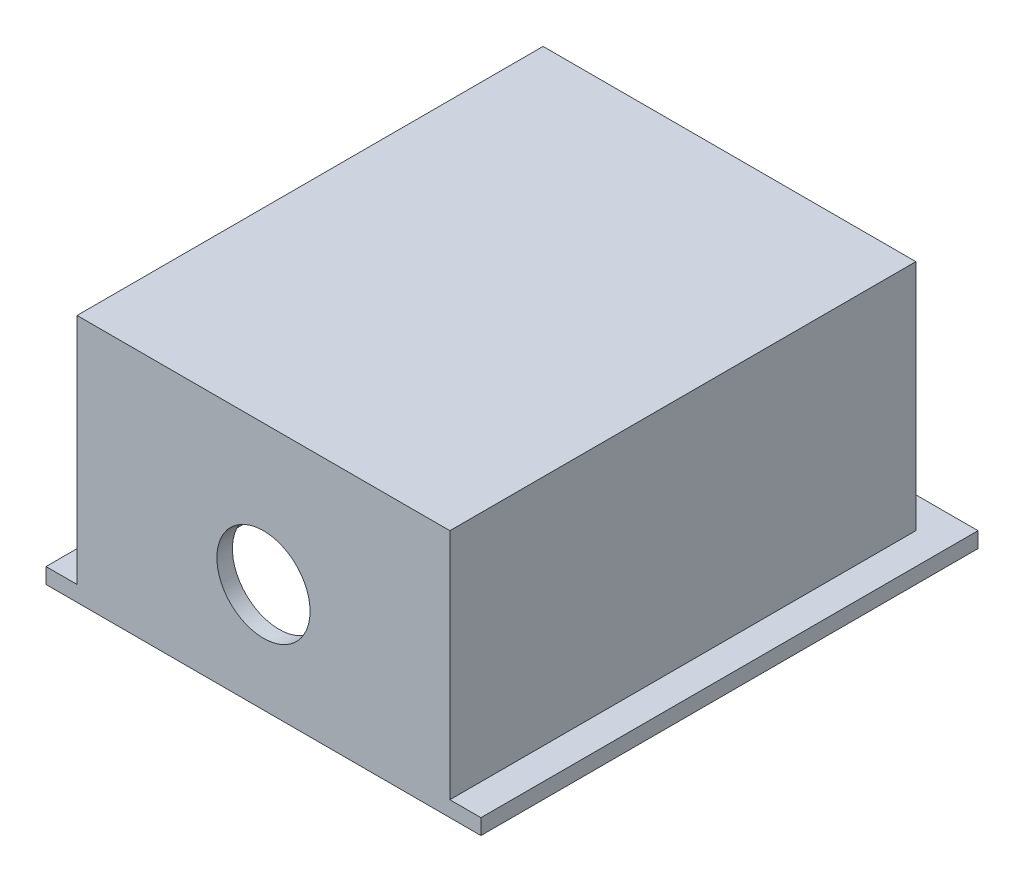
ISO-10303-21;
HEADER;
FILE_DESCRIPTION(('STEP AP214'),'2;1');
FILE_NAME('part.step','',(''),(''),'','','');
FILE_SCHEMA(('AUTOMOTIVE_DESIGN { 1 0 10303 214 1 1 1 1 }'));
ENDSEC;
DATA;
#1=APPLICATION_CONTEXT('core data for automotive mechanical design processes');
#2=APPLICATION_PROTOCOL_DEFINITION('international standard','automotive_design',2000,#1);
#3=PRODUCT_CONTEXT('',#1,'mechanical');
#4=PRODUCT('Part','Part','',(#3));
#5=PRODUCT_RELATED_PRODUCT_CATEGORY('part','',(#4));
#6=PRODUCT_DEFINITION_FORMATION('','',#4);
#7=PRODUCT_DEFINITION_CONTEXT('part definition',#1,'design');
#8=PRODUCT_DEFINITION('design','',#6,#7);
#9=PRODUCT_DEFINITION_SHAPE('','',#8);
#10=(LENGTH_UNIT() NAMED_UNIT(*) SI_UNIT(.MILLI.,.METRE.));
#11=(NAMED_UNIT(*) PLANE_ANGLE_UNIT() SI_UNIT($,.RADIAN.));
#12=(NAMED_UNIT(*) SI_UNIT($,.STERADIAN.) SOLID_ANGLE_UNIT());
#13=UNCERTAINTY_MEASURE_WITH_UNIT(LENGTH_MEASURE(1.E-05),#10,'distance_accuracy_value','');
#14=(GEOMETRIC_REPRESENTATION_CONTEXT(3) GLOBAL_UNCERTAINTY_ASSIGNED_CONTEXT((#13)) GLOBAL_UNIT_ASSIGNED_CONTEXT((#10,
#11,#12)) REPRESENTATION_CONTEXT('',''));
#15=CARTESIAN_POINT('',(0.,0.,0.));
#16=DIRECTION('',(0.,0.,1.));
#17=DIRECTION('',(1.,0.,0.));
#18=AXIS2_PLACEMENT_3D('',#15,#16,#17);
#19=CARTESIAN_POINT('',(60.,40.,150.));
#20=DIRECTION('',(-1.,0.,0.));
#21=DIRECTION('',(0.,0.,1.));
#22=AXIS2_PLACEMENT_3D('',#19,#20,#21);
#23=PLANE('',#22);
#24=DIRECTION('',(0.,0.,1.));
#25=VECTOR('',#24,1.);
#26=CARTESIAN_POINT('',(60.,-35.,0.));
#27=LINE('',#26,#25);
#28=CARTESIAN_POINT('',(60.,-35.,0.));
#29=VERTEX_POINT('',#28);
#30=CARTESIAN_POINT('',(60.,-35.,150.));
#31=VERTEX_POINT('',#30);
#32=EDGE_CURVE('E215',#29,#31,#27,.T.);
#33=ORIENTED_EDGE('',*,*,#32,.F.);
#34=DIRECTION('',(0.,1.,0.));
#35=VECTOR('',#34,1.);
#36=CARTESIAN_POINT('',(60.,40.,0.));
#37=LINE('',#36,#35);
#38=CARTESIAN_POINT('',(60.,40.,0.));
#39=VERTEX_POINT('',#38);
#40=EDGE_CURVE('E88',#29,#39,#37,.T.);
#41=ORIENTED_EDGE('',*,*,#40,.T.);
#42=DIRECTION('',(0.,0.,-1.));
#43=VECTOR('',#42,1.);
#44=CARTESIAN_POINT('',(60.,40.,150.));
#45=LINE('',#44,#43);
#46=CARTESIAN_POINT('',(60.,40.,150.));
#47=VERTEX_POINT('',#46);
#48=EDGE_CURVE('E11',#47,#39,#45,.T.);
#49=ORIENTED_EDGE('',*,*,#48,.F.);
#50=DIRECTION('',(0.,1.,0.));
#51=VECTOR('',#50,1.);
#52=CARTESIAN_POINT('',(60.,40.,150.));
#53=LINE('',#52,#51);
#54=EDGE_CURVE('E104',#31,#47,#53,.T.);
#55=ORIENTED_EDGE('',*,*,#54,.F.);
#56=EDGE_LOOP('',(#33,#41,#49,#55));
#57=FACE_BOUND('',#56,.T.);
#58=ADVANCED_FACE('F41',(#57),#23,.F.);
#59=CARTESIAN_POINT('',(-60.,40.,150.));
#60=DIRECTION('',(1.,0.,0.));
#61=DIRECTION('',(0.,0.,-1.));
#62=AXIS2_PLACEMENT_3D('',#59,#60,#61);
#63=PLANE('',#62);
#64=DIRECTION('',(0.,0.,-1.));
#65=VECTOR('',#64,1.);
#66=CARTESIAN_POINT('',(-60.,-35.,0.));
#67=LINE('',#66,#65);
#68=CARTESIAN_POINT('',(-60.,-35.,150.));
#69=VERTEX_POINT('',#68);
#70=CARTESIAN_POINT('',(-60.,-35.,0.));
#71=VERTEX_POINT('',#70);
#72=EDGE_CURVE('E209',#69,#71,#67,.T.);
#73=ORIENTED_EDGE('',*,*,#72,.F.);
#74=DIRECTION('',(0.,-1.,0.));
#75=VECTOR('',#74,1.);
#76=CARTESIAN_POINT('',(-60.,40.,150.));
#77=LINE('',#76,#75);
#78=CARTESIAN_POINT('',(-60.,40.,150.));
#79=VERTEX_POINT('',#78);
#80=EDGE_CURVE('E95',#79,#69,#77,.T.);
#81=ORIENTED_EDGE('',*,*,#80,.F.);
#82=DIRECTION('',(0.,0.,-1.));
#83=VECTOR('',#82,1.);
#84=CARTESIAN_POINT('',(-60.,40.,150.));
#85=LINE('',#84,#83);
#86=CARTESIAN_POINT('',(-60.,40.,0.));
#87=VERTEX_POINT('',#86);
#88=EDGE_CURVE('E50',#79,#87,#85,.T.);
#89=ORIENTED_EDGE('',*,*,#88,.T.);
#90=DIRECTION('',(0.,-1.,0.));
#91=VECTOR('',#90,1.);
#92=CARTESIAN_POINT('',(-60.,40.,0.));
#93=LINE('',#92,#91);
#94=EDGE_CURVE('E87',#87,#71,#93,.T.);
#95=ORIENTED_EDGE('',*,*,#94,.T.);
#96=EDGE_LOOP('',(#73,#81,#89,#95));
#97=FACE_BOUND('',#96,.T.);
#98=ADVANCED_FACE('F93',(#97),#63,.F.);
#99=CARTESIAN_POINT('',(0.,0.,0.));
#100=DIRECTION('',(0.,0.,1.));
#101=DIRECTION('',(1.,0.,0.));
#102=AXIS2_PLACEMENT_3D('',#99,#100,#101);
#103=PLANE('',#102);
#104=CARTESIAN_POINT('',(0.,-5.,0.));
#105=DIRECTION('',(0.,0.,-1.));
#106=DIRECTION('',(-1.,0.,0.));
#107=AXIS2_PLACEMENT_3D('',#104,#105,#106);
#108=CIRCLE('',#107,15.);
#109=CARTESIAN_POINT('',(-15.,-5.,0.));
#110=VERTEX_POINT('',#109);
#111=EDGE_CURVE('E229',#110,#110,#108,.T.);
#112=ORIENTED_EDGE('',*,*,#111,.F.);
#113=EDGE_LOOP('',(#112));
#114=FACE_BOUND('',#113,.T.);
#115=DIRECTION('',(1.,0.,0.));
#116=VECTOR('',#115,1.);
#117=CARTESIAN_POINT('',(0.,-35.,0.));
#118=LINE('',#117,#116);
#119=EDGE_CURVE('E102',#71,#29,#118,.T.);
#120=ORIENTED_EDGE('',*,*,#119,.F.);
#121=ORIENTED_EDGE('',*,*,#94,.F.);
#122=DIRECTION('',(-1.,0.,0.));
#123=VECTOR('',#122,1.);
#124=CARTESIAN_POINT('',(-60.,40.,0.));
#125=LINE('',#124,#123);
#126=EDGE_CURVE('E78',#39,#87,#125,.T.);
#127=ORIENTED_EDGE('',*,*,#126,.F.);
#128=ORIENTED_EDGE('',*,*,#40,.F.);
#129=EDGE_LOOP('',(#120,#121,#127,#128));
#130=FACE_BOUND('',#129,.T.);
#131=ADVANCED_FACE('F100',(#114,#130),#103,.F.);
#132=CARTESIAN_POINT('',(-60.,-40.,150.));
#133=DIRECTION('',(0.,1.,0.));
#134=DIRECTION('',(0.,0.,1.));
#135=AXIS2_PLACEMENT_3D('',#132,#133,#134);
#136=PLANE('',#135);
#137=DIRECTION('',(1.,0.,0.));
#138=VECTOR('',#137,1.);
#139=CARTESIAN_POINT('',(-60.,-40.,150.));
#140=LINE('',#139,#138);
#141=CARTESIAN_POINT('',(-70.,-40.,150.));
#142=VERTEX_POINT('',#141);
#143=CARTESIAN_POINT('',(70.,-40.,150.));
#144=VERTEX_POINT('',#143);
#145=EDGE_CURVE('E97',#142,#144,#140,.T.);
#146=ORIENTED_EDGE('',*,*,#145,.F.);
#147=DIRECTION('',(0.,0.,-1.));
#148=VECTOR('',#147,1.);
#149=CARTESIAN_POINT('',(-70.,-40.,0.));
#150=LINE('',#149,#148);
#151=CARTESIAN_POINT('',(-70.,-40.,-10.));
#152=VERTEX_POINT('',#151);
#153=EDGE_CURVE('E189',#142,#152,#150,.T.);
#154=ORIENTED_EDGE('',*,*,#153,.T.);
#155=DIRECTION('',(1.,0.,0.));
#156=VECTOR('',#155,1.);
#157=CARTESIAN_POINT('',(0.,-40.,-10.));
#158=LINE('',#157,#156);
#159=CARTESIAN_POINT('',(70.,-40.,-10.));
#160=VERTEX_POINT('',#159);
#161=EDGE_CURVE('E185',#152,#160,#158,.T.);
#162=ORIENTED_EDGE('',*,*,#161,.T.);
#163=DIRECTION('',(0.,0.,-1.));
#164=VECTOR('',#163,1.);
#165=CARTESIAN_POINT('',(70.,-40.,0.));
#166=LINE('',#165,#164);
#167=EDGE_CURVE('E180',#144,#160,#166,.T.);
#168=ORIENTED_EDGE('',*,*,#167,.F.);
#169=EDGE_LOOP('',(#146,#154,#162,#168));
#170=FACE_BOUND('',#169,.T.);
#171=DIRECTION('',(1.,0.,0.));
#172=VECTOR('',#171,1.);
#173=CARTESIAN_POINT('',(-60.,-40.,5.));
#174=LINE('',#173,#172);
#175=CARTESIAN_POINT('',(-55.,-40.,5.));
#176=VERTEX_POINT('',#175);
#177=CARTESIAN_POINT('',(55.,-40.,5.));
#178=VERTEX_POINT('',#177);
#179=EDGE_CURVE('E119',#176,#178,#174,.T.);
#180=ORIENTED_EDGE('',*,*,#179,.F.);
#181=DIRECTION('',(0.,0.,-1.));
#182=VECTOR('',#181,1.);
#183=CARTESIAN_POINT('',(-55.,-40.,150.));
#184=LINE('',#183,#182);
#185=CARTESIAN_POINT('',(-55.,-40.,145.));
#186=VERTEX_POINT('',#185);
#187=EDGE_CURVE('E125',#186,#176,#184,.T.);
#188=ORIENTED_EDGE('',*,*,#187,.F.);
#189=DIRECTION('',(1.,0.,0.));
#190=VECTOR('',#189,1.);
#191=CARTESIAN_POINT('',(-60.,-40.,145.));
#192=LINE('',#191,#190);
#193=CARTESIAN_POINT('',(55.,-40.,145.));
#194=VERTEX_POINT('',#193);
#195=EDGE_CURVE('E57',#186,#194,#192,.T.);
#196=ORIENTED_EDGE('',*,*,#195,.T.);
#197=DIRECTION('',(0.,0.,-1.));
#198=VECTOR('',#197,1.);
#199=CARTESIAN_POINT('',(55.,-40.,150.));
#200=LINE('',#199,#198);
#201=EDGE_CURVE('E130',#194,#178,#200,.T.);
#202=ORIENTED_EDGE('',*,*,#201,.T.);
#203=EDGE_LOOP('',(#180,#188,#196,#202));
#204=FACE_BOUND('',#203,.T.);
#205=ADVANCED_FACE('F261',(#170,#204),#136,.F.);
#206=CARTESIAN_POINT('',(-60.,40.,150.));
#207=DIRECTION('',(0.,-1.,0.));
#208=DIRECTION('',(0.,0.,-1.));
#209=AXIS2_PLACEMENT_3D('',#206,#207,#208);
#210=PLANE('',#209);
#211=ORIENTED_EDGE('',*,*,#126,.T.);
#212=ORIENTED_EDGE('',*,*,#88,.F.);
#213=DIRECTION('',(-1.,0.,0.));
#214=VECTOR('',#213,1.);
#215=CARTESIAN_POINT('',(-60.,40.,150.));
#216=LINE('',#215,#214);
#217=EDGE_CURVE('E66',#47,#79,#216,.T.);
#218=ORIENTED_EDGE('',*,*,#217,.F.);
#219=ORIENTED_EDGE('',*,*,#48,.T.);
#220=EDGE_LOOP('',(#211,#212,#218,#219));
#221=FACE_BOUND('',#220,.T.);
#222=ADVANCED_FACE('F80',(#221),#210,.F.);
#223=CARTESIAN_POINT('',(0.,0.,150.));
#224=DIRECTION('',(0.,0.,1.));
#225=DIRECTION('',(1.,0.,0.));
#226=AXIS2_PLACEMENT_3D('',#223,#224,#225);
#227=PLANE('',#226);
#228=CARTESIAN_POINT('',(0.,-5.,150.));
#229=DIRECTION('',(0.,0.,1.));
#230=DIRECTION('',(1.,0.,0.));
#231=AXIS2_PLACEMENT_3D('',#228,#229,#230);
#232=CIRCLE('',#231,15.);
#233=CARTESIAN_POINT('',(15.,-5.,150.));
#234=VERTEX_POINT('',#233);
#235=EDGE_CURVE('E193',#234,#234,#232,.T.);
#236=ORIENTED_EDGE('',*,*,#235,.F.);
#237=EDGE_LOOP('',(#236));
#238=FACE_BOUND('',#237,.T.);
#239=ORIENTED_EDGE('',*,*,#145,.T.);
#240=DIRECTION('',(0.,-1.,0.));
#241=VECTOR('',#240,1.);
#242=CARTESIAN_POINT('',(70.,-35.,150.));
#243=LINE('',#242,#241);
#244=CARTESIAN_POINT('',(70.,-35.,150.));
#245=VERTEX_POINT('',#244);
#246=EDGE_CURVE('E163',#245,#144,#243,.T.);
#247=ORIENTED_EDGE('',*,*,#246,.F.);
#248=DIRECTION('',(1.,0.,0.));
#249=VECTOR('',#248,1.);
#250=CARTESIAN_POINT('',(0.,-35.,150.));
#251=LINE('',#250,#249);
#252=EDGE_CURVE('E184',#31,#245,#251,.T.);
#253=ORIENTED_EDGE('',*,*,#252,.F.);
#254=ORIENTED_EDGE('',*,*,#54,.T.);
#255=ORIENTED_EDGE('',*,*,#217,.T.);
#256=ORIENTED_EDGE('',*,*,#80,.T.);
#257=DIRECTION('',(-1.,0.,0.));
#258=VECTOR('',#257,1.);
#259=CARTESIAN_POINT('',(0.,-35.,150.));
#260=LINE('',#259,#258);
#261=CARTESIAN_POINT('',(-70.,-35.,150.));
#262=VERTEX_POINT('',#261);
#263=EDGE_CURVE('E205',#69,#262,#260,.T.);
#264=ORIENTED_EDGE('',*,*,#263,.T.);
#265=DIRECTION('',(0.,-1.,0.));
#266=VECTOR('',#265,1.);
#267=CARTESIAN_POINT('',(-70.,-35.,150.));
#268=LINE('',#267,#266);
#269=EDGE_CURVE('E164',#262,#142,#268,.T.);
#270=ORIENTED_EDGE('',*,*,#269,.T.);
#271=EDGE_LOOP('',(#239,#247,#253,#254,#255,#256,#264,#270));
#272=FACE_BOUND('',#271,.T.);
#273=ADVANCED_FACE('F304',(#238,#272),#227,.T.);
#274=CARTESIAN_POINT('',(55.,40.,150.));
#275=DIRECTION('',(-1.,0.,0.));
#276=DIRECTION('',(0.,0.,1.));
#277=AXIS2_PLACEMENT_3D('',#274,#275,#276);
#278=PLANE('',#277);
#279=DIRECTION('',(0.,1.,0.));
#280=VECTOR('',#279,1.);
#281=CARTESIAN_POINT('',(55.,40.,5.));
#282=LINE('',#281,#280);
#283=CARTESIAN_POINT('',(55.,35.,5.));
#284=VERTEX_POINT('',#283);
#285=EDGE_CURVE('E153',#178,#284,#282,.T.);
#286=ORIENTED_EDGE('',*,*,#285,.F.);
#287=ORIENTED_EDGE('',*,*,#201,.F.);
#288=DIRECTION('',(0.,1.,0.));
#289=VECTOR('',#288,1.);
#290=CARTESIAN_POINT('',(55.,40.,145.));
#291=LINE('',#290,#289);
#292=CARTESIAN_POINT('',(55.,35.,145.));
#293=VERTEX_POINT('',#292);
#294=EDGE_CURVE('E123',#194,#293,#291,.T.);
#295=ORIENTED_EDGE('',*,*,#294,.T.);
#296=DIRECTION('',(0.,0.,-1.));
#297=VECTOR('',#296,1.);
#298=CARTESIAN_POINT('',(55.,35.,150.));
#299=LINE('',#298,#297);
#300=EDGE_CURVE('E111',#293,#284,#299,.T.);
#301=ORIENTED_EDGE('',*,*,#300,.T.);
#302=EDGE_LOOP('',(#286,#287,#295,#301));
#303=FACE_BOUND('',#302,.T.);
#304=ADVANCED_FACE('F256',(#303),#278,.T.);
#305=CARTESIAN_POINT('',(-60.,35.,150.));
#306=DIRECTION('',(0.,-1.,0.));
#307=DIRECTION('',(0.,0.,-1.));
#308=AXIS2_PLACEMENT_3D('',#305,#306,#307);
#309=PLANE('',#308);
#310=DIRECTION('',(-1.,0.,0.));
#311=VECTOR('',#310,1.);
#312=CARTESIAN_POINT('',(-60.,35.,5.));
#313=LINE('',#312,#311);
#314=CARTESIAN_POINT('',(-55.,35.,5.));
#315=VERTEX_POINT('',#314);
#316=EDGE_CURVE('E143',#284,#315,#313,.T.);
#317=ORIENTED_EDGE('',*,*,#316,.F.);
#318=ORIENTED_EDGE('',*,*,#300,.F.);
#319=DIRECTION('',(-1.,0.,0.));
#320=VECTOR('',#319,1.);
#321=CARTESIAN_POINT('',(-60.,35.,145.));
#322=LINE('',#321,#320);
#323=CARTESIAN_POINT('',(-55.,35.,145.));
#324=VERTEX_POINT('',#323);
#325=EDGE_CURVE('E139',#293,#324,#322,.T.);
#326=ORIENTED_EDGE('',*,*,#325,.T.);
#327=DIRECTION('',(0.,0.,-1.));
#328=VECTOR('',#327,1.);
#329=CARTESIAN_POINT('',(-55.,35.,150.));
#330=LINE('',#329,#328);
#331=EDGE_CURVE('E129',#324,#315,#330,.T.);
#332=ORIENTED_EDGE('',*,*,#331,.T.);
#333=EDGE_LOOP('',(#317,#318,#326,#332));
#334=FACE_BOUND('',#333,.T.);
#335=ADVANCED_FACE('F276',(#334),#309,.T.);
#336=CARTESIAN_POINT('',(-55.,40.,150.));
#337=DIRECTION('',(1.,0.,0.));
#338=DIRECTION('',(0.,0.,-1.));
#339=AXIS2_PLACEMENT_3D('',#336,#337,#338);
#340=PLANE('',#339);
#341=DIRECTION('',(0.,-1.,0.));
#342=VECTOR('',#341,1.);
#343=CARTESIAN_POINT('',(-55.,40.,5.));
#344=LINE('',#343,#342);
#345=EDGE_CURVE('E124',#315,#176,#344,.T.);
#346=ORIENTED_EDGE('',*,*,#345,.F.);
#347=ORIENTED_EDGE('',*,*,#331,.F.);
#348=DIRECTION('',(0.,-1.,0.));
#349=VECTOR('',#348,1.);
#350=CARTESIAN_POINT('',(-55.,40.,145.));
#351=LINE('',#350,#349);
#352=EDGE_CURVE('E133',#324,#186,#351,.T.);
#353=ORIENTED_EDGE('',*,*,#352,.T.);
#354=ORIENTED_EDGE('',*,*,#187,.T.);
#355=EDGE_LOOP('',(#346,#347,#353,#354));
#356=FACE_BOUND('',#355,.T.);
#357=ADVANCED_FACE('F278',(#356),#340,.T.);
#358=CARTESIAN_POINT('',(0.,0.,145.));
#359=DIRECTION('',(0.,0.,1.));
#360=DIRECTION('',(1.,0.,0.));
#361=AXIS2_PLACEMENT_3D('',#358,#359,#360);
#362=PLANE('',#361);
#363=CARTESIAN_POINT('',(0.,-5.,145.));
#364=DIRECTION('',(0.,0.,1.));
#365=DIRECTION('',(1.,0.,0.));
#366=AXIS2_PLACEMENT_3D('',#363,#364,#365);
#367=CIRCLE('',#366,15.);
#368=CARTESIAN_POINT('',(15.,-5.,145.));
#369=VERTEX_POINT('',#368);
#370=EDGE_CURVE('E225',#369,#369,#367,.T.);
#371=ORIENTED_EDGE('',*,*,#370,.T.);
#372=EDGE_LOOP('',(#371));
#373=FACE_BOUND('',#372,.T.);
#374=ORIENTED_EDGE('',*,*,#294,.F.);
#375=ORIENTED_EDGE('',*,*,#195,.F.);
#376=ORIENTED_EDGE('',*,*,#352,.F.);
#377=ORIENTED_EDGE('',*,*,#325,.F.);
#378=EDGE_LOOP('',(#374,#375,#376,#377));
#379=FACE_BOUND('',#378,.T.);
#380=ADVANCED_FACE('F244',(#373,#379),#362,.F.);
#381=CARTESIAN_POINT('',(0.,0.,5.));
#382=DIRECTION('',(0.,0.,1.));
#383=DIRECTION('',(1.,0.,0.));
#384=AXIS2_PLACEMENT_3D('',#381,#382,#383);
#385=PLANE('',#384);
#386=CARTESIAN_POINT('',(0.,-5.,5.00000000000078));
#387=DIRECTION('',(0.,0.,1.));
#388=DIRECTION('',(1.,0.,0.));
#389=AXIS2_PLACEMENT_3D('',#386,#387,#388);
#390=CIRCLE('',#389,15.);
#391=CARTESIAN_POINT('',(15.,-5.,5.00000000000078));
#392=VERTEX_POINT('',#391);
#393=EDGE_CURVE('E44',#392,#392,#390,.T.);
#394=ORIENTED_EDGE('',*,*,#393,.F.);
#395=EDGE_LOOP('',(#394));
#396=FACE_BOUND('',#395,.T.);
#397=ORIENTED_EDGE('',*,*,#285,.T.);
#398=ORIENTED_EDGE('',*,*,#316,.T.);
#399=ORIENTED_EDGE('',*,*,#345,.T.);
#400=ORIENTED_EDGE('',*,*,#179,.T.);
#401=EDGE_LOOP('',(#397,#398,#399,#400));
#402=FACE_BOUND('',#401,.T.);
#403=ADVANCED_FACE('F240',(#396,#402),#385,.T.);
#404=CARTESIAN_POINT('',(70.,-35.,0.));
#405=DIRECTION('',(-1.,0.,0.));
#406=DIRECTION('',(0.,0.,1.));
#407=AXIS2_PLACEMENT_3D('',#404,#405,#406);
#408=PLANE('',#407);
#409=ORIENTED_EDGE('',*,*,#167,.T.);
#410=DIRECTION('',(0.,-1.,0.));
#411=VECTOR('',#410,1.);
#412=CARTESIAN_POINT('',(70.,-35.,-10.));
#413=LINE('',#412,#411);
#414=CARTESIAN_POINT('',(70.,-35.,-10.));
#415=VERTEX_POINT('',#414);
#416=EDGE_CURVE('E173',#415,#160,#413,.T.);
#417=ORIENTED_EDGE('',*,*,#416,.F.);
#418=DIRECTION('',(0.,0.,-1.));
#419=VECTOR('',#418,1.);
#420=CARTESIAN_POINT('',(70.,-35.,0.));
#421=LINE('',#420,#419);
#422=EDGE_CURVE('E169',#245,#415,#421,.T.);
#423=ORIENTED_EDGE('',*,*,#422,.F.);
#424=ORIENTED_EDGE('',*,*,#246,.T.);
#425=EDGE_LOOP('',(#409,#417,#423,#424));
#426=FACE_BOUND('',#425,.T.);
#427=ADVANCED_FACE('F243',(#426),#408,.F.);
#428=CARTESIAN_POINT('',(0.,-35.,-10.));
#429=DIRECTION('',(0.,0.,-1.));
#430=DIRECTION('',(-1.,0.,0.));
#431=AXIS2_PLACEMENT_3D('',#428,#429,#430);
#432=PLANE('',#431);
#433=ORIENTED_EDGE('',*,*,#161,.F.);
#434=DIRECTION('',(0.,-1.,0.));
#435=VECTOR('',#434,1.);
#436=CARTESIAN_POINT('',(-70.,-35.,-10.));
#437=LINE('',#436,#435);
#438=CARTESIAN_POINT('',(-70.,-35.,-10.));
#439=VERTEX_POINT('',#438);
#440=EDGE_CURVE('E168',#439,#152,#437,.T.);
#441=ORIENTED_EDGE('',*,*,#440,.F.);
#442=DIRECTION('',(1.,0.,0.));
#443=VECTOR('',#442,1.);
#444=CARTESIAN_POINT('',(0.,-35.,-10.));
#445=LINE('',#444,#443);
#446=EDGE_CURVE('E197',#439,#415,#445,.T.);
#447=ORIENTED_EDGE('',*,*,#446,.T.);
#448=ORIENTED_EDGE('',*,*,#416,.T.);
#449=EDGE_LOOP('',(#433,#441,#447,#448));
#450=FACE_BOUND('',#449,.T.);
#451=ADVANCED_FACE('F335',(#450),#432,.T.);
#452=CARTESIAN_POINT('',(-70.,-35.,0.));
#453=DIRECTION('',(-1.,0.,0.));
#454=DIRECTION('',(0.,0.,1.));
#455=AXIS2_PLACEMENT_3D('',#452,#453,#454);
#456=PLANE('',#455);
#457=ORIENTED_EDGE('',*,*,#153,.F.);
#458=ORIENTED_EDGE('',*,*,#269,.F.);
#459=DIRECTION('',(0.,0.,-1.));
#460=VECTOR('',#459,1.);
#461=CARTESIAN_POINT('',(-70.,-35.,0.));
#462=LINE('',#461,#460);
#463=EDGE_CURVE('E201',#262,#439,#462,.T.);
#464=ORIENTED_EDGE('',*,*,#463,.T.);
#465=ORIENTED_EDGE('',*,*,#440,.T.);
#466=EDGE_LOOP('',(#457,#458,#464,#465));
#467=FACE_BOUND('',#466,.T.);
#468=ADVANCED_FACE('F333',(#467),#456,.T.);
#469=CARTESIAN_POINT('',(0.,-35.,0.));
#470=DIRECTION('',(0.,-1.,0.));
#471=DIRECTION('',(0.,0.,-1.));
#472=AXIS2_PLACEMENT_3D('',#469,#470,#471);
#473=PLANE('',#472);
#474=ORIENTED_EDGE('',*,*,#252,.T.);
#475=ORIENTED_EDGE('',*,*,#422,.T.);
#476=ORIENTED_EDGE('',*,*,#446,.F.);
#477=ORIENTED_EDGE('',*,*,#463,.F.);
#478=ORIENTED_EDGE('',*,*,#263,.F.);
#479=ORIENTED_EDGE('',*,*,#72,.T.);
#480=ORIENTED_EDGE('',*,*,#119,.T.);
#481=ORIENTED_EDGE('',*,*,#32,.T.);
#482=EDGE_LOOP('',(#474,#475,#476,#477,#478,#479,#480,#481));
#483=FACE_BOUND('',#482,.T.);
#484=ADVANCED_FACE('F301',(#483),#473,.F.);
#485=CARTESIAN_POINT('',(0.,-5.,10000.));
#486=DIRECTION('',(0.,0.,-1.));
#487=DIRECTION('',(-1.,0.,0.));
#488=AXIS2_PLACEMENT_3D('',#485,#486,#487);
#489=CYLINDRICAL_SURFACE('',#488,15.);
#490=ORIENTED_EDGE('',*,*,#393,.T.);
#491=EDGE_LOOP('',(#490));
#492=FACE_BOUND('',#491,.T.);
#493=ORIENTED_EDGE('',*,*,#111,.T.);
#494=EDGE_LOOP('',(#493));
#495=FACE_BOUND('',#494,.T.);
#496=ADVANCED_FACE('F238',(#492,#495),#489,.F.);
#497=ORIENTED_EDGE('',*,*,#235,.T.);
#498=EDGE_LOOP('',(#497));
#499=FACE_BOUND('',#498,.T.);
#500=ORIENTED_EDGE('',*,*,#370,.F.);
#501=EDGE_LOOP('',(#500));
#502=FACE_BOUND('',#501,.T.);
#503=ADVANCED_FACE('F448',(#499,#502),#489,.F.);
#504=CLOSED_SHELL('',(#58,#98,#131,#205,#222,#273,#304,#335,#357,#380,#403,#427,#451,#468,#484,
#496,#503));
#505=MANIFOLD_SOLID_BREP('B2',#504);
#506=ADVANCED_BREP_SHAPE_REPRESENTATION('',(#18,#505),#14);
#507=SHAPE_DEFINITION_REPRESENTATION(#9,#506);
ENDSEC;
END-ISO-10303-21;
